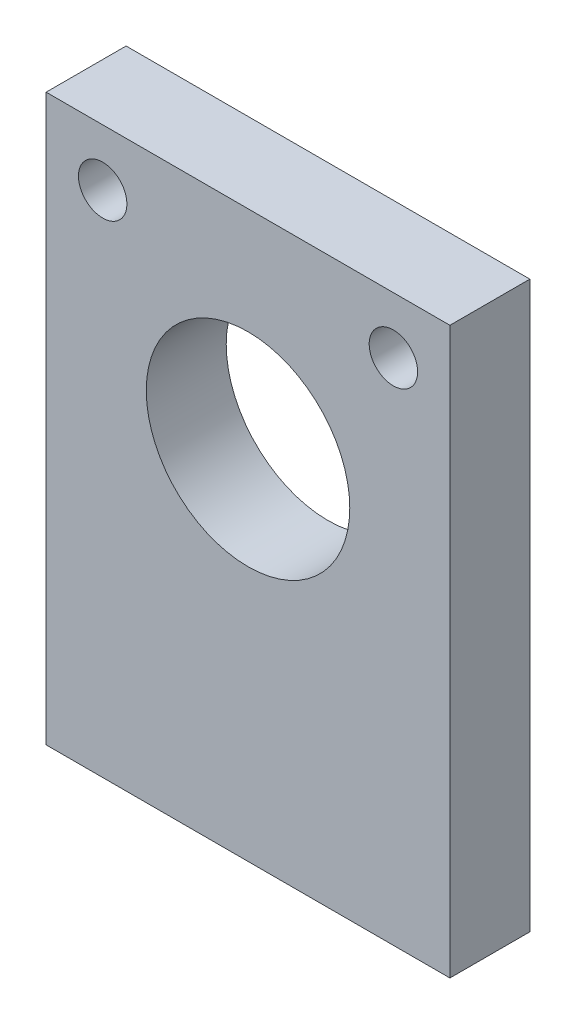
ISO-10303-21;
HEADER;
FILE_DESCRIPTION(('STEP AP214'),'2;1');
FILE_NAME('part.step','',(''),(''),'','','');
FILE_SCHEMA(('AUTOMOTIVE_DESIGN { 1 0 10303 214 1 1 1 1 }'));
ENDSEC;
DATA;
#1=APPLICATION_CONTEXT('core data for automotive mechanical design processes');
#2=APPLICATION_PROTOCOL_DEFINITION('international standard','automotive_design',2000,#1);
#3=PRODUCT_CONTEXT('',#1,'mechanical');
#4=PRODUCT('Part','Part','',(#3));
#5=PRODUCT_RELATED_PRODUCT_CATEGORY('part','',(#4));
#6=PRODUCT_DEFINITION_FORMATION('','',#4);
#7=PRODUCT_DEFINITION_CONTEXT('part definition',#1,'design');
#8=PRODUCT_DEFINITION('design','',#6,#7);
#9=PRODUCT_DEFINITION_SHAPE('','',#8);
#10=(LENGTH_UNIT() NAMED_UNIT(*) SI_UNIT(.MILLI.,.METRE.));
#11=(NAMED_UNIT(*) PLANE_ANGLE_UNIT() SI_UNIT($,.RADIAN.));
#12=(NAMED_UNIT(*) SI_UNIT($,.STERADIAN.) SOLID_ANGLE_UNIT());
#13=UNCERTAINTY_MEASURE_WITH_UNIT(LENGTH_MEASURE(1.E-05),#10,'distance_accuracy_value','');
#14=(GEOMETRIC_REPRESENTATION_CONTEXT(3) GLOBAL_UNCERTAINTY_ASSIGNED_CONTEXT((#13)) GLOBAL_UNIT_ASSIGNED_CONTEXT((#10,
#11,#12)) REPRESENTATION_CONTEXT('',''));
#15=CARTESIAN_POINT('',(0.,0.,0.));
#16=DIRECTION('',(0.,0.,1.));
#17=DIRECTION('',(1.,0.,0.));
#18=AXIS2_PLACEMENT_3D('',#15,#16,#17);
#19=CARTESIAN_POINT('',(0.,0.,9.9));
#20=DIRECTION('',(0.,0.,1.));
#21=DIRECTION('',(1.,0.,0.));
#22=AXIS2_PLACEMENT_3D('',#19,#20,#21);
#23=PLANE('',#22);
#24=CARTESIAN_POINT('',(0.,9.20979845958893,9.9));
#25=DIRECTION('',(0.,0.,1.));
#26=DIRECTION('',(1.,0.,0.));
#27=AXIS2_PLACEMENT_3D('',#24,#25,#26);
#28=CIRCLE('',#27,12.6);
#29=CARTESIAN_POINT('',(12.6,9.20979845958893,9.9));
#30=VERTEX_POINT('',#29);
#31=EDGE_CURVE('E125',#30,#30,#28,.T.);
#32=ORIENTED_EDGE('',*,*,#31,.F.);
#33=EDGE_LOOP('',(#32));
#34=FACE_BOUND('',#33,.T.);
#35=CARTESIAN_POINT('',(-18.,28.,9.9));
#36=DIRECTION('',(0.,0.,1.));
#37=DIRECTION('',(1.,0.,0.));
#38=AXIS2_PLACEMENT_3D('',#35,#36,#37);
#39=CIRCLE('',#38,3.);
#40=CARTESIAN_POINT('',(-21.,28.,9.9));
#41=VERTEX_POINT('',#40);
#42=EDGE_CURVE('E101',#41,#41,#39,.T.);
#43=ORIENTED_EDGE('',*,*,#42,.F.);
#44=EDGE_LOOP('',(#43));
#45=FACE_BOUND('',#44,.T.);
#46=DIRECTION('',(0.,1.,0.));
#47=VECTOR('',#46,1.);
#48=CARTESIAN_POINT('',(25.,35.,9.9));
#49=LINE('',#48,#47);
#50=CARTESIAN_POINT('',(25.,-35.,9.9));
#51=VERTEX_POINT('',#50);
#52=CARTESIAN_POINT('',(25.,35.,9.9));
#53=VERTEX_POINT('',#52);
#54=EDGE_CURVE('E86',#51,#53,#49,.T.);
#55=ORIENTED_EDGE('',*,*,#54,.T.);
#56=DIRECTION('',(-1.,0.,0.));
#57=VECTOR('',#56,1.);
#58=CARTESIAN_POINT('',(-25.,35.,9.9));
#59=LINE('',#58,#57);
#60=CARTESIAN_POINT('',(-25.,35.,9.9));
#61=VERTEX_POINT('',#60);
#62=EDGE_CURVE('E81',#53,#61,#59,.T.);
#63=ORIENTED_EDGE('',*,*,#62,.T.);
#64=DIRECTION('',(0.,-1.,0.));
#65=VECTOR('',#64,1.);
#66=CARTESIAN_POINT('',(-25.,35.,9.9));
#67=LINE('',#66,#65);
#68=CARTESIAN_POINT('',(-25.,-35.,9.9));
#69=VERTEX_POINT('',#68);
#70=EDGE_CURVE('E84',#61,#69,#67,.T.);
#71=ORIENTED_EDGE('',*,*,#70,.T.);
#72=DIRECTION('',(1.,0.,0.));
#73=VECTOR('',#72,1.);
#74=CARTESIAN_POINT('',(-25.,-35.,9.9));
#75=LINE('',#74,#73);
#76=EDGE_CURVE('E51',#69,#51,#75,.T.);
#77=ORIENTED_EDGE('',*,*,#76,.T.);
#78=EDGE_LOOP('',(#55,#63,#71,#77));
#79=FACE_BOUND('',#78,.T.);
#80=CARTESIAN_POINT('',(18.,28.,9.9));
#81=DIRECTION('',(0.,0.,1.));
#82=DIRECTION('',(-1.,0.,0.));
#83=AXIS2_PLACEMENT_3D('',#80,#81,#82);
#84=CIRCLE('',#83,3.);
#85=CARTESIAN_POINT('',(15.,28.,9.9));
#86=VERTEX_POINT('',#85);
#87=EDGE_CURVE('E116',#86,#86,#84,.T.);
#88=ORIENTED_EDGE('',*,*,#87,.F.);
#89=EDGE_LOOP('',(#88));
#90=FACE_BOUND('',#89,.T.);
#91=ADVANCED_FACE('F34',(#34,#45,#79,#90),#23,.T.);
#92=CARTESIAN_POINT('',(0.,0.,0.));
#93=DIRECTION('',(0.,0.,1.));
#94=DIRECTION('',(1.,0.,0.));
#95=AXIS2_PLACEMENT_3D('',#92,#93,#94);
#96=PLANE('',#95);
#97=CARTESIAN_POINT('',(0.,9.20979845958893,0.));
#98=DIRECTION('',(0.,0.,1.));
#99=DIRECTION('',(1.,0.,0.));
#100=AXIS2_PLACEMENT_3D('',#97,#98,#99);
#101=CIRCLE('',#100,12.6);
#102=CARTESIAN_POINT('',(12.6,9.20979845958893,0.));
#103=VERTEX_POINT('',#102);
#104=EDGE_CURVE('E122',#103,#103,#101,.T.);
#105=ORIENTED_EDGE('',*,*,#104,.T.);
#106=EDGE_LOOP('',(#105));
#107=FACE_BOUND('',#106,.T.);
#108=CARTESIAN_POINT('',(-18.,28.,0.));
#109=DIRECTION('',(0.,0.,1.));
#110=DIRECTION('',(1.,0.,0.));
#111=AXIS2_PLACEMENT_3D('',#108,#109,#110);
#112=CIRCLE('',#111,3.);
#113=CARTESIAN_POINT('',(-21.,28.,0.));
#114=VERTEX_POINT('',#113);
#115=EDGE_CURVE('E113',#114,#114,#112,.T.);
#116=ORIENTED_EDGE('',*,*,#115,.T.);
#117=EDGE_LOOP('',(#116));
#118=FACE_BOUND('',#117,.T.);
#119=DIRECTION('',(0.,1.,0.));
#120=VECTOR('',#119,1.);
#121=CARTESIAN_POINT('',(25.,35.,0.));
#122=LINE('',#121,#120);
#123=CARTESIAN_POINT('',(25.,-35.,0.));
#124=VERTEX_POINT('',#123);
#125=CARTESIAN_POINT('',(25.,35.,0.));
#126=VERTEX_POINT('',#125);
#127=EDGE_CURVE('E98',#124,#126,#122,.T.);
#128=ORIENTED_EDGE('',*,*,#127,.F.);
#129=DIRECTION('',(1.,0.,0.));
#130=VECTOR('',#129,1.);
#131=CARTESIAN_POINT('',(-25.,-35.,0.));
#132=LINE('',#131,#130);
#133=CARTESIAN_POINT('',(-25.,-35.,0.));
#134=VERTEX_POINT('',#133);
#135=EDGE_CURVE('E74',#134,#124,#132,.T.);
#136=ORIENTED_EDGE('',*,*,#135,.F.);
#137=DIRECTION('',(0.,-1.,0.));
#138=VECTOR('',#137,1.);
#139=CARTESIAN_POINT('',(-25.,35.,0.));
#140=LINE('',#139,#138);
#141=CARTESIAN_POINT('',(-25.,35.,0.));
#142=VERTEX_POINT('',#141);
#143=EDGE_CURVE('E68',#142,#134,#140,.T.);
#144=ORIENTED_EDGE('',*,*,#143,.F.);
#145=DIRECTION('',(-1.,0.,0.));
#146=VECTOR('',#145,1.);
#147=CARTESIAN_POINT('',(-25.,35.,0.));
#148=LINE('',#147,#146);
#149=EDGE_CURVE('E90',#126,#142,#148,.T.);
#150=ORIENTED_EDGE('',*,*,#149,.F.);
#151=EDGE_LOOP('',(#128,#136,#144,#150));
#152=FACE_BOUND('',#151,.T.);
#153=CARTESIAN_POINT('',(18.,28.,0.));
#154=DIRECTION('',(0.,0.,1.));
#155=DIRECTION('',(-1.,0.,0.));
#156=AXIS2_PLACEMENT_3D('',#153,#154,#155);
#157=CIRCLE('',#156,3.);
#158=CARTESIAN_POINT('',(15.,28.,0.));
#159=VERTEX_POINT('',#158);
#160=EDGE_CURVE('E119',#159,#159,#157,.T.);
#161=ORIENTED_EDGE('',*,*,#160,.T.);
#162=EDGE_LOOP('',(#161));
#163=FACE_BOUND('',#162,.T.);
#164=ADVANCED_FACE('F109',(#107,#118,#152,#163),#96,.F.);
#165=CARTESIAN_POINT('',(25.,35.,9.9));
#166=DIRECTION('',(-1.,0.,0.));
#167=DIRECTION('',(0.,-1.,0.));
#168=AXIS2_PLACEMENT_3D('',#165,#166,#167);
#169=PLANE('',#168);
#170=ORIENTED_EDGE('',*,*,#127,.T.);
#171=DIRECTION('',(0.,0.,-1.));
#172=VECTOR('',#171,1.);
#173=CARTESIAN_POINT('',(25.,35.,9.9));
#174=LINE('',#173,#172);
#175=EDGE_CURVE('E11',#53,#126,#174,.T.);
#176=ORIENTED_EDGE('',*,*,#175,.F.);
#177=ORIENTED_EDGE('',*,*,#54,.F.);
#178=DIRECTION('',(0.,0.,-1.));
#179=VECTOR('',#178,1.);
#180=CARTESIAN_POINT('',(25.,-35.,9.9));
#181=LINE('',#180,#179);
#182=EDGE_CURVE('E94',#51,#124,#181,.T.);
#183=ORIENTED_EDGE('',*,*,#182,.T.);
#184=EDGE_LOOP('',(#170,#176,#177,#183));
#185=FACE_BOUND('',#184,.T.);
#186=ADVANCED_FACE('F36',(#185),#169,.F.);
#187=CARTESIAN_POINT('',(-25.,35.,9.9));
#188=DIRECTION('',(0.,-1.,0.));
#189=DIRECTION('',(0.,0.,-1.));
#190=AXIS2_PLACEMENT_3D('',#187,#188,#189);
#191=PLANE('',#190);
#192=ORIENTED_EDGE('',*,*,#149,.T.);
#193=DIRECTION('',(0.,0.,-1.));
#194=VECTOR('',#193,1.);
#195=CARTESIAN_POINT('',(-25.,35.,9.9));
#196=LINE('',#195,#194);
#197=EDGE_CURVE('E43',#61,#142,#196,.T.);
#198=ORIENTED_EDGE('',*,*,#197,.F.);
#199=ORIENTED_EDGE('',*,*,#62,.F.);
#200=ORIENTED_EDGE('',*,*,#175,.T.);
#201=EDGE_LOOP('',(#192,#198,#199,#200));
#202=FACE_BOUND('',#201,.T.);
#203=ADVANCED_FACE('F89',(#202),#191,.F.);
#204=CARTESIAN_POINT('',(-25.,35.,9.9));
#205=DIRECTION('',(1.,0.,0.));
#206=DIRECTION('',(0.,0.,-1.));
#207=AXIS2_PLACEMENT_3D('',#204,#205,#206);
#208=PLANE('',#207);
#209=ORIENTED_EDGE('',*,*,#143,.T.);
#210=DIRECTION('',(0.,0.,-1.));
#211=VECTOR('',#210,1.);
#212=CARTESIAN_POINT('',(-25.,-35.,9.9));
#213=LINE('',#212,#211);
#214=EDGE_CURVE('E91',#69,#134,#213,.T.);
#215=ORIENTED_EDGE('',*,*,#214,.F.);
#216=ORIENTED_EDGE('',*,*,#70,.F.);
#217=ORIENTED_EDGE('',*,*,#197,.T.);
#218=EDGE_LOOP('',(#209,#215,#216,#217));
#219=FACE_BOUND('',#218,.T.);
#220=ADVANCED_FACE('F92',(#219),#208,.F.);
#221=CARTESIAN_POINT('',(-25.,-35.,9.9));
#222=DIRECTION('',(0.,1.,0.));
#223=DIRECTION('',(0.,0.,1.));
#224=AXIS2_PLACEMENT_3D('',#221,#222,#223);
#225=PLANE('',#224);
#226=ORIENTED_EDGE('',*,*,#135,.T.);
#227=ORIENTED_EDGE('',*,*,#182,.F.);
#228=ORIENTED_EDGE('',*,*,#76,.F.);
#229=ORIENTED_EDGE('',*,*,#214,.T.);
#230=EDGE_LOOP('',(#226,#227,#228,#229));
#231=FACE_BOUND('',#230,.T.);
#232=ADVANCED_FACE('F106',(#231),#225,.F.);
#233=CARTESIAN_POINT('',(-18.,28.,9.9));
#234=DIRECTION('',(0.,0.,-1.));
#235=DIRECTION('',(-1.,0.,0.));
#236=AXIS2_PLACEMENT_3D('',#233,#234,#235);
#237=CYLINDRICAL_SURFACE('',#236,3.);
#238=CARTESIAN_POINT('',(-21.,28.,9.9));
#239=CARTESIAN_POINT('',(-21.,28.,9.796875));
#240=CARTESIAN_POINT('',(-21.,28.,9.69375));
#241=CARTESIAN_POINT('',(-21.,28.,9.4875));
#242=CARTESIAN_POINT('',(-21.,28.,9.384375));
#243=CARTESIAN_POINT('',(-21.,28.,9.178125));
#244=CARTESIAN_POINT('',(-21.,28.,9.075));
#245=CARTESIAN_POINT('',(-21.,28.,8.86875));
#246=CARTESIAN_POINT('',(-21.,28.,8.765625));
#247=CARTESIAN_POINT('',(-21.,28.,8.559375));
#248=CARTESIAN_POINT('',(-21.,28.,8.45625));
#249=CARTESIAN_POINT('',(-21.,28.,8.25));
#250=CARTESIAN_POINT('',(-21.,28.,8.146875));
#251=CARTESIAN_POINT('',(-21.,28.,7.940625));
#252=CARTESIAN_POINT('',(-21.,28.,7.8375));
#253=CARTESIAN_POINT('',(-21.,28.,7.63125));
#254=CARTESIAN_POINT('',(-21.,28.,7.528125));
#255=CARTESIAN_POINT('',(-21.,28.,7.321875));
#256=CARTESIAN_POINT('',(-21.,28.,7.21875));
#257=CARTESIAN_POINT('',(-21.,28.,7.0125));
#258=CARTESIAN_POINT('',(-21.,28.,6.909375));
#259=CARTESIAN_POINT('',(-21.,28.,6.703125));
#260=CARTESIAN_POINT('',(-21.,28.,6.6));
#261=CARTESIAN_POINT('',(-21.,28.,6.39375));
#262=CARTESIAN_POINT('',(-21.,28.,6.290625));
#263=CARTESIAN_POINT('',(-21.,28.,6.084375));
#264=CARTESIAN_POINT('',(-21.,28.,5.98125));
#265=CARTESIAN_POINT('',(-21.,28.,5.775));
#266=CARTESIAN_POINT('',(-21.,28.,5.671875));
#267=CARTESIAN_POINT('',(-21.,28.,5.465625));
#268=CARTESIAN_POINT('',(-21.,28.,5.3625));
#269=CARTESIAN_POINT('',(-21.,28.,5.15625));
#270=CARTESIAN_POINT('',(-21.,28.,5.053125));
#271=CARTESIAN_POINT('',(-21.,28.,4.846875));
#272=CARTESIAN_POINT('',(-21.,28.,4.74375));
#273=CARTESIAN_POINT('',(-21.,28.,4.5375));
#274=CARTESIAN_POINT('',(-21.,28.,4.434375));
#275=CARTESIAN_POINT('',(-21.,28.,4.228125));
#276=CARTESIAN_POINT('',(-21.,28.,4.125));
#277=CARTESIAN_POINT('',(-21.,28.,3.91875));
#278=CARTESIAN_POINT('',(-21.,28.,3.815625));
#279=CARTESIAN_POINT('',(-21.,28.,3.609375));
#280=CARTESIAN_POINT('',(-21.,28.,3.50625));
#281=CARTESIAN_POINT('',(-21.,28.,3.3));
#282=CARTESIAN_POINT('',(-21.,28.,3.196875));
#283=CARTESIAN_POINT('',(-21.,28.,2.990625));
#284=CARTESIAN_POINT('',(-21.,28.,2.8875));
#285=CARTESIAN_POINT('',(-21.,28.,2.68125));
#286=CARTESIAN_POINT('',(-21.,28.,2.578125));
#287=CARTESIAN_POINT('',(-21.,28.,2.371875));
#288=CARTESIAN_POINT('',(-21.,28.,2.26875));
#289=CARTESIAN_POINT('',(-21.,28.,2.0625));
#290=CARTESIAN_POINT('',(-21.,28.,1.959375));
#291=CARTESIAN_POINT('',(-21.,28.,1.753125));
#292=CARTESIAN_POINT('',(-21.,28.,1.65));
#293=CARTESIAN_POINT('',(-21.,28.,1.44375));
#294=CARTESIAN_POINT('',(-21.,28.,1.340625));
#295=CARTESIAN_POINT('',(-21.,28.,1.134375));
#296=CARTESIAN_POINT('',(-21.,28.,1.03125));
#297=CARTESIAN_POINT('',(-21.,28.,0.825));
#298=CARTESIAN_POINT('',(-21.,28.,0.721875));
#299=CARTESIAN_POINT('',(-21.,28.,0.515625));
#300=CARTESIAN_POINT('',(-21.,28.,0.4125));
#301=CARTESIAN_POINT('',(-21.,28.,0.20625));
#302=CARTESIAN_POINT('',(-21.,28.,0.103125));
#303=CARTESIAN_POINT('',(-21.,28.,0.));
#304=B_SPLINE_CURVE_WITH_KNOTS('',3,(#238,#239,#240,#241,#242,#243,#244,#245,#246,#247,#248,
#249,#250,#251,#252,#253,#254,#255,#256,#257,#258,#259,#260,#261,#262,#263,#264,#265,#266,#267,
#268,#269,#270,#271,#272,#273,#274,#275,#276,#277,#278,#279,#280,#281,#282,#283,#284,#285,#286,
#287,#288,#289,#290,#291,#292,#293,#294,#295,#296,#297,#298,#299,#300,#301,#302,#303),
.UNSPECIFIED.,.F.,.F.,(4,2,2,2,2,2,2,2,2,2,2,2,2,2,2,2,2,2,2,2,2,2,2,2,2,2,2,2,2,2,2,2,4),(0.,
0.309375000000001,0.618750000000001,0.928125,1.2375,1.546875,1.85625,2.165625,2.475,2.784375,
3.09375,3.403125,3.7125,4.021875,4.33125,4.640625,4.95,5.259375,5.56875,5.878125,6.1875,
6.496875,6.80625,7.115625,7.425,7.734375,8.04375,8.353125,8.6625,8.971875,9.28125,9.590625,9.9),.UNSPECIFIED.);
#305=EDGE_CURVE('BSEAM145',#41,#114,#304,.T.);
#306=ORIENTED_EDGE('',*,*,#42,.T.);
#307=ORIENTED_EDGE('',*,*,#115,.F.);
#308=ORIENTED_EDGE('',*,*,#305,.T.);
#309=ORIENTED_EDGE('',*,*,#305,.F.);
#310=EDGE_LOOP('',(#306,#308,#307,#309));
#311=FACE_BOUND('',#310,.T.);
#312=ADVANCED_FACE('F145',(#311),#237,.F.);
#313=CARTESIAN_POINT('',(18.,28.,9.9));
#314=DIRECTION('',(0.,0.,-1.));
#315=DIRECTION('',(-1.,0.,0.));
#316=AXIS2_PLACEMENT_3D('',#313,#314,#315);
#317=CYLINDRICAL_SURFACE('',#316,3.);
#318=CARTESIAN_POINT('',(15.,28.,9.9));
#319=CARTESIAN_POINT('',(15.,28.,9.796875));
#320=CARTESIAN_POINT('',(15.,28.,9.69375));
#321=CARTESIAN_POINT('',(15.,28.,9.4875));
#322=CARTESIAN_POINT('',(15.,28.,9.384375));
#323=CARTESIAN_POINT('',(15.,28.,9.178125));
#324=CARTESIAN_POINT('',(15.,28.,9.075));
#325=CARTESIAN_POINT('',(15.,28.,8.86875));
#326=CARTESIAN_POINT('',(15.,28.,8.765625));
#327=CARTESIAN_POINT('',(15.,28.,8.559375));
#328=CARTESIAN_POINT('',(15.,28.,8.45625));
#329=CARTESIAN_POINT('',(15.,28.,8.25));
#330=CARTESIAN_POINT('',(15.,28.,8.146875));
#331=CARTESIAN_POINT('',(15.,28.,7.940625));
#332=CARTESIAN_POINT('',(15.,28.,7.8375));
#333=CARTESIAN_POINT('',(15.,28.,7.63125));
#334=CARTESIAN_POINT('',(15.,28.,7.528125));
#335=CARTESIAN_POINT('',(15.,28.,7.321875));
#336=CARTESIAN_POINT('',(15.,28.,7.21875));
#337=CARTESIAN_POINT('',(15.,28.,7.0125));
#338=CARTESIAN_POINT('',(15.,28.,6.909375));
#339=CARTESIAN_POINT('',(15.,28.,6.703125));
#340=CARTESIAN_POINT('',(15.,28.,6.6));
#341=CARTESIAN_POINT('',(15.,28.,6.39375));
#342=CARTESIAN_POINT('',(15.,28.,6.290625));
#343=CARTESIAN_POINT('',(15.,28.,6.084375));
#344=CARTESIAN_POINT('',(15.,28.,5.98125));
#345=CARTESIAN_POINT('',(15.,28.,5.775));
#346=CARTESIAN_POINT('',(15.,28.,5.671875));
#347=CARTESIAN_POINT('',(15.,28.,5.465625));
#348=CARTESIAN_POINT('',(15.,28.,5.3625));
#349=CARTESIAN_POINT('',(15.,28.,5.15625));
#350=CARTESIAN_POINT('',(15.,28.,5.053125));
#351=CARTESIAN_POINT('',(15.,28.,4.846875));
#352=CARTESIAN_POINT('',(15.,28.,4.74375));
#353=CARTESIAN_POINT('',(15.,28.,4.5375));
#354=CARTESIAN_POINT('',(15.,28.,4.434375));
#355=CARTESIAN_POINT('',(15.,28.,4.228125));
#356=CARTESIAN_POINT('',(15.,28.,4.125));
#357=CARTESIAN_POINT('',(15.,28.,3.91875));
#358=CARTESIAN_POINT('',(15.,28.,3.815625));
#359=CARTESIAN_POINT('',(15.,28.,3.609375));
#360=CARTESIAN_POINT('',(15.,28.,3.50625));
#361=CARTESIAN_POINT('',(15.,28.,3.3));
#362=CARTESIAN_POINT('',(15.,28.,3.196875));
#363=CARTESIAN_POINT('',(15.,28.,2.990625));
#364=CARTESIAN_POINT('',(15.,28.,2.8875));
#365=CARTESIAN_POINT('',(15.,28.,2.68125));
#366=CARTESIAN_POINT('',(15.,28.,2.578125));
#367=CARTESIAN_POINT('',(15.,28.,2.371875));
#368=CARTESIAN_POINT('',(15.,28.,2.26875));
#369=CARTESIAN_POINT('',(15.,28.,2.0625));
#370=CARTESIAN_POINT('',(15.,28.,1.959375));
#371=CARTESIAN_POINT('',(15.,28.,1.753125));
#372=CARTESIAN_POINT('',(15.,28.,1.65));
#373=CARTESIAN_POINT('',(15.,28.,1.44375));
#374=CARTESIAN_POINT('',(15.,28.,1.340625));
#375=CARTESIAN_POINT('',(15.,28.,1.134375));
#376=CARTESIAN_POINT('',(15.,28.,1.03125));
#377=CARTESIAN_POINT('',(15.,28.,0.825));
#378=CARTESIAN_POINT('',(15.,28.,0.721875));
#379=CARTESIAN_POINT('',(15.,28.,0.515625));
#380=CARTESIAN_POINT('',(15.,28.,0.4125));
#381=CARTESIAN_POINT('',(15.,28.,0.20625));
#382=CARTESIAN_POINT('',(15.,28.,0.103125));
#383=CARTESIAN_POINT('',(15.,28.,0.));
#384=B_SPLINE_CURVE_WITH_KNOTS('',3,(#318,#319,#320,#321,#322,#323,#324,#325,#326,#327,#328,
#329,#330,#331,#332,#333,#334,#335,#336,#337,#338,#339,#340,#341,#342,#343,#344,#345,#346,#347,
#348,#349,#350,#351,#352,#353,#354,#355,#356,#357,#358,#359,#360,#361,#362,#363,#364,#365,#366,
#367,#368,#369,#370,#371,#372,#373,#374,#375,#376,#377,#378,#379,#380,#381,#382,#383),
.UNSPECIFIED.,.F.,.F.,(4,2,2,2,2,2,2,2,2,2,2,2,2,2,2,2,2,2,2,2,2,2,2,2,2,2,2,2,2,2,2,2,4),(0.,
0.309375000000001,0.618750000000001,0.928125,1.2375,1.546875,1.85625,2.165625,2.475,2.784375,
3.09375,3.403125,3.7125,4.021875,4.33125,4.640625,4.95,5.259375,5.56875,5.878125,6.1875,
6.496875,6.80625,7.115625,7.425,7.734375,8.04375,8.353125,8.6625,8.971875,9.28125,9.590625,9.9),.UNSPECIFIED.);
#385=EDGE_CURVE('BSEAM136',#86,#159,#384,.T.);
#386=ORIENTED_EDGE('',*,*,#87,.T.);
#387=ORIENTED_EDGE('',*,*,#160,.F.);
#388=ORIENTED_EDGE('',*,*,#385,.T.);
#389=ORIENTED_EDGE('',*,*,#385,.F.);
#390=EDGE_LOOP('',(#386,#388,#387,#389));
#391=FACE_BOUND('',#390,.T.);
#392=ADVANCED_FACE('F136',(#391),#317,.F.);
#393=CARTESIAN_POINT('',(0.,9.20979845958893,0.));
#394=DIRECTION('',(0.,0.,1.));
#395=DIRECTION('',(1.,0.,0.));
#396=AXIS2_PLACEMENT_3D('',#393,#394,#395);
#397=CYLINDRICAL_SURFACE('',#396,12.6);
#398=CARTESIAN_POINT('',(12.6,9.20979845958893,0.));
#399=CARTESIAN_POINT('',(12.6,9.20979845958893,0.103125));
#400=CARTESIAN_POINT('',(12.6,9.20979845958893,0.20625));
#401=CARTESIAN_POINT('',(12.6,9.20979845958893,0.4125));
#402=CARTESIAN_POINT('',(12.6,9.20979845958893,0.515625));
#403=CARTESIAN_POINT('',(12.6,9.20979845958893,0.721875));
#404=CARTESIAN_POINT('',(12.6,9.20979845958893,0.825));
#405=CARTESIAN_POINT('',(12.6,9.20979845958893,1.03125));
#406=CARTESIAN_POINT('',(12.6,9.20979845958893,1.134375));
#407=CARTESIAN_POINT('',(12.6,9.20979845958893,1.340625));
#408=CARTESIAN_POINT('',(12.6,9.20979845958893,1.44375));
#409=CARTESIAN_POINT('',(12.6,9.20979845958893,1.65));
#410=CARTESIAN_POINT('',(12.6,9.20979845958893,1.753125));
#411=CARTESIAN_POINT('',(12.6,9.20979845958893,1.959375));
#412=CARTESIAN_POINT('',(12.6,9.20979845958893,2.0625));
#413=CARTESIAN_POINT('',(12.6,9.20979845958893,2.26875));
#414=CARTESIAN_POINT('',(12.6,9.20979845958893,2.371875));
#415=CARTESIAN_POINT('',(12.6,9.20979845958893,2.578125));
#416=CARTESIAN_POINT('',(12.6,9.20979845958893,2.68125));
#417=CARTESIAN_POINT('',(12.6,9.20979845958893,2.8875));
#418=CARTESIAN_POINT('',(12.6,9.20979845958893,2.990625));
#419=CARTESIAN_POINT('',(12.6,9.20979845958893,3.196875));
#420=CARTESIAN_POINT('',(12.6,9.20979845958893,3.3));
#421=CARTESIAN_POINT('',(12.6,9.20979845958893,3.50625));
#422=CARTESIAN_POINT('',(12.6,9.20979845958893,3.609375));
#423=CARTESIAN_POINT('',(12.6,9.20979845958893,3.815625));
#424=CARTESIAN_POINT('',(12.6,9.20979845958893,3.91875));
#425=CARTESIAN_POINT('',(12.6,9.20979845958893,4.125));
#426=CARTESIAN_POINT('',(12.6,9.20979845958893,4.228125));
#427=CARTESIAN_POINT('',(12.6,9.20979845958893,4.434375));
#428=CARTESIAN_POINT('',(12.6,9.20979845958893,4.5375));
#429=CARTESIAN_POINT('',(12.6,9.20979845958893,4.74375));
#430=CARTESIAN_POINT('',(12.6,9.20979845958893,4.846875));
#431=CARTESIAN_POINT('',(12.6,9.20979845958893,5.053125));
#432=CARTESIAN_POINT('',(12.6,9.20979845958893,5.15625));
#433=CARTESIAN_POINT('',(12.6,9.20979845958893,5.3625));
#434=CARTESIAN_POINT('',(12.6,9.20979845958893,5.465625));
#435=CARTESIAN_POINT('',(12.6,9.20979845958893,5.671875));
#436=CARTESIAN_POINT('',(12.6,9.20979845958893,5.775));
#437=CARTESIAN_POINT('',(12.6,9.20979845958893,5.98125));
#438=CARTESIAN_POINT('',(12.6,9.20979845958893,6.084375));
#439=CARTESIAN_POINT('',(12.6,9.20979845958893,6.290625));
#440=CARTESIAN_POINT('',(12.6,9.20979845958893,6.39375));
#441=CARTESIAN_POINT('',(12.6,9.20979845958893,6.6));
#442=CARTESIAN_POINT('',(12.6,9.20979845958893,6.703125));
#443=CARTESIAN_POINT('',(12.6,9.20979845958893,6.909375));
#444=CARTESIAN_POINT('',(12.6,9.20979845958893,7.0125));
#445=CARTESIAN_POINT('',(12.6,9.20979845958893,7.21875));
#446=CARTESIAN_POINT('',(12.6,9.20979845958893,7.321875));
#447=CARTESIAN_POINT('',(12.6,9.20979845958893,7.528125));
#448=CARTESIAN_POINT('',(12.6,9.20979845958893,7.63125));
#449=CARTESIAN_POINT('',(12.6,9.20979845958893,7.8375));
#450=CARTESIAN_POINT('',(12.6,9.20979845958893,7.940625));
#451=CARTESIAN_POINT('',(12.6,9.20979845958893,8.146875));
#452=CARTESIAN_POINT('',(12.6,9.20979845958893,8.25));
#453=CARTESIAN_POINT('',(12.6,9.20979845958893,8.45625));
#454=CARTESIAN_POINT('',(12.6,9.20979845958893,8.559375));
#455=CARTESIAN_POINT('',(12.6,9.20979845958893,8.765625));
#456=CARTESIAN_POINT('',(12.6,9.20979845958893,8.86875));
#457=CARTESIAN_POINT('',(12.6,9.20979845958893,9.075));
#458=CARTESIAN_POINT('',(12.6,9.20979845958893,9.178125));
#459=CARTESIAN_POINT('',(12.6,9.20979845958893,9.384375));
#460=CARTESIAN_POINT('',(12.6,9.20979845958893,9.4875));
#461=CARTESIAN_POINT('',(12.6,9.20979845958893,9.69375));
#462=CARTESIAN_POINT('',(12.6,9.20979845958893,9.796875));
#463=CARTESIAN_POINT('',(12.6,9.20979845958893,9.9));
#464=B_SPLINE_CURVE_WITH_KNOTS('',3,(#398,#399,#400,#401,#402,#403,#404,#405,#406,#407,#408,
#409,#410,#411,#412,#413,#414,#415,#416,#417,#418,#419,#420,#421,#422,#423,#424,#425,#426,#427,
#428,#429,#430,#431,#432,#433,#434,#435,#436,#437,#438,#439,#440,#441,#442,#443,#444,#445,#446,
#447,#448,#449,#450,#451,#452,#453,#454,#455,#456,#457,#458,#459,#460,#461,#462,#463),
.UNSPECIFIED.,.F.,.F.,(4,2,2,2,2,2,2,2,2,2,2,2,2,2,2,2,2,2,2,2,2,2,2,2,2,2,2,2,2,2,2,2,4),(0.,
0.309375,0.61875,0.928125,1.2375,1.546875,1.85625,2.165625,2.475,2.784375,3.09375,3.403125,
3.7125,4.021875,4.33125,4.640625,4.95,5.259375,5.56875,5.878125,6.1875,6.496875,6.80625,
7.115625,7.425,7.734375,8.04375,8.353125,8.6625,8.971875,9.28125,9.590625,9.9),.UNSPECIFIED.);
#465=EDGE_CURVE('BSEAM133',#103,#30,#464,.T.);
#466=ORIENTED_EDGE('',*,*,#104,.F.);
#467=ORIENTED_EDGE('',*,*,#31,.T.);
#468=ORIENTED_EDGE('',*,*,#465,.T.);
#469=ORIENTED_EDGE('',*,*,#465,.F.);
#470=EDGE_LOOP('',(#466,#468,#467,#469));
#471=FACE_BOUND('',#470,.T.);
#472=ADVANCED_FACE('F133',(#471),#397,.F.);
#473=CLOSED_SHELL('',(#91,#164,#186,#203,#220,#232,#312,#392,#472));
#474=MANIFOLD_SOLID_BREP('B2',#473);
#475=ADVANCED_BREP_SHAPE_REPRESENTATION('',(#18,#474),#14);
#476=SHAPE_DEFINITION_REPRESENTATION(#9,#475);
ENDSEC;
END-ISO-10303-21;
